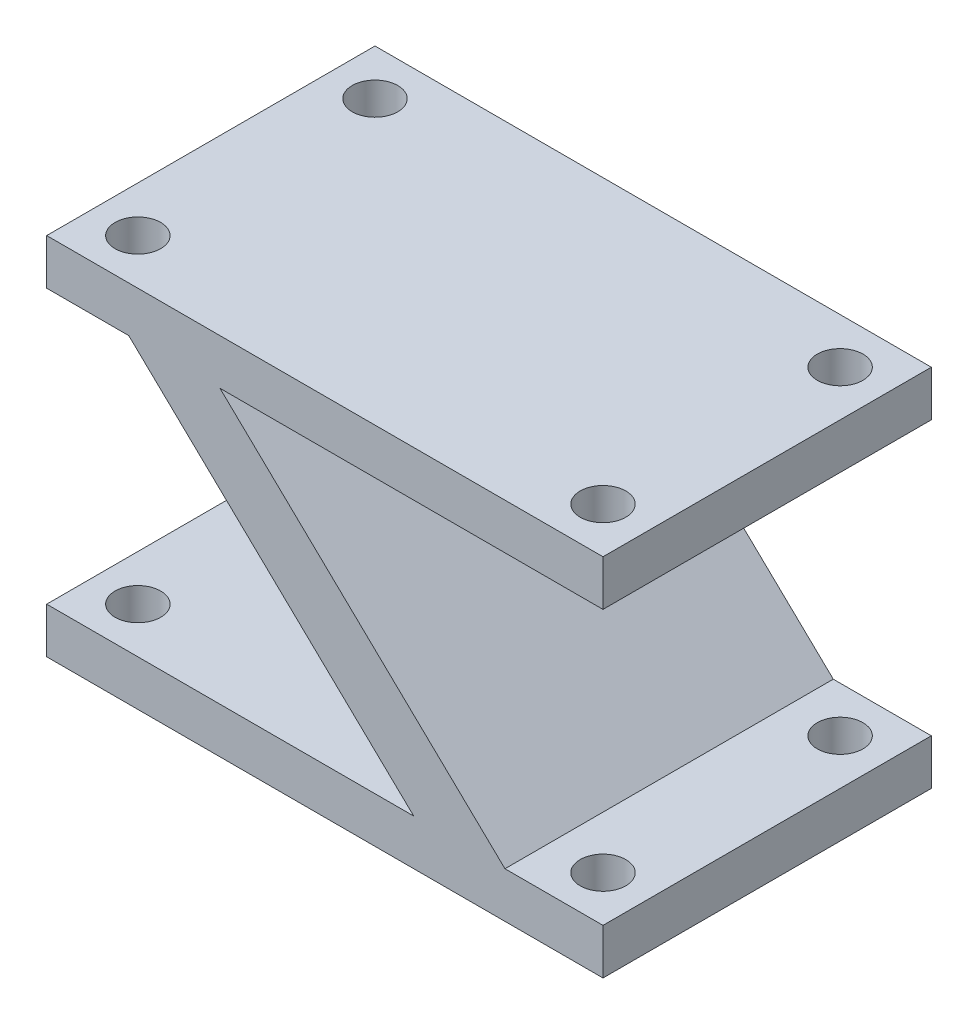
ISO-10303-21;
HEADER;
FILE_DESCRIPTION(('STEP AP214'),'2;1');
FILE_NAME('part.step','',(''),(''),'','','');
FILE_SCHEMA(('AUTOMOTIVE_DESIGN { 1 0 10303 214 1 1 1 1 }'));
ENDSEC;
DATA;
#1=APPLICATION_CONTEXT('core data for automotive mechanical design processes');
#2=APPLICATION_PROTOCOL_DEFINITION('international standard','automotive_design',2000,#1);
#3=PRODUCT_CONTEXT('',#1,'mechanical');
#4=PRODUCT('Part','Part','',(#3));
#5=PRODUCT_RELATED_PRODUCT_CATEGORY('part','',(#4));
#6=PRODUCT_DEFINITION_FORMATION('','',#4);
#7=PRODUCT_DEFINITION_CONTEXT('part definition',#1,'design');
#8=PRODUCT_DEFINITION('design','',#6,#7);
#9=PRODUCT_DEFINITION_SHAPE('','',#8);
#10=(LENGTH_UNIT() NAMED_UNIT(*) SI_UNIT(.MILLI.,.METRE.));
#11=(NAMED_UNIT(*) PLANE_ANGLE_UNIT() SI_UNIT($,.RADIAN.));
#12=(NAMED_UNIT(*) SI_UNIT($,.STERADIAN.) SOLID_ANGLE_UNIT());
#13=UNCERTAINTY_MEASURE_WITH_UNIT(LENGTH_MEASURE(1.E-05),#10,'distance_accuracy_value','');
#14=(GEOMETRIC_REPRESENTATION_CONTEXT(3) GLOBAL_UNCERTAINTY_ASSIGNED_CONTEXT((#13)) GLOBAL_UNIT_ASSIGNED_CONTEXT((#10,
#11,#12)) REPRESENTATION_CONTEXT('',''));
#15=CARTESIAN_POINT('',(0.,0.,0.));
#16=DIRECTION('',(0.,0.,1.));
#17=DIRECTION('',(1.,0.,0.));
#18=AXIS2_PLACEMENT_3D('',#15,#16,#17);
#19=CARTESIAN_POINT('',(0.,5.,0.));
#20=DIRECTION('',(0.,-1.,0.));
#21=DIRECTION('',(0.,0.,-1.));
#22=AXIS2_PLACEMENT_3D('',#19,#20,#21);
#23=PLANE('',#22);
#24=CARTESIAN_POINT('',(-25.5,5.,13.));
#25=DIRECTION('',(0.,1.,0.));
#26=DIRECTION('',(0.,0.,1.));
#27=AXIS2_PLACEMENT_3D('',#24,#25,#26);
#28=CIRCLE('',#27,2.5);
#29=CARTESIAN_POINT('',(-25.5,5.,15.5));
#30=VERTEX_POINT('',#29);
#31=EDGE_CURVE('E193',#30,#30,#28,.T.);
#32=ORIENTED_EDGE('',*,*,#31,.F.);
#33=EDGE_LOOP('',(#32));
#34=FACE_BOUND('',#33,.T.);
#35=CARTESIAN_POINT('',(-25.5,5.,-13.));
#36=DIRECTION('',(0.,1.,0.));
#37=DIRECTION('',(0.,0.,1.));
#38=AXIS2_PLACEMENT_3D('',#35,#36,#37);
#39=CIRCLE('',#38,2.5);
#40=CARTESIAN_POINT('',(-25.5,5.,-10.5));
#41=VERTEX_POINT('',#40);
#42=EDGE_CURVE('E217',#41,#41,#39,.T.);
#43=ORIENTED_EDGE('',*,*,#42,.F.);
#44=EDGE_LOOP('',(#43));
#45=FACE_BOUND('',#44,.T.);
#46=DIRECTION('',(0.,0.,1.));
#47=VECTOR('',#46,1.);
#48=CARTESIAN_POINT('',(9.75,5.,-69.0055144077579));
#49=LINE('',#48,#47);
#50=CARTESIAN_POINT('',(9.74999999999999,5.,-18.));
#51=VERTEX_POINT('',#50);
#52=CARTESIAN_POINT('',(9.75,5.,18.));
#53=VERTEX_POINT('',#52);
#54=EDGE_CURVE('E63',#51,#53,#49,.T.);
#55=ORIENTED_EDGE('',*,*,#54,.F.);
#56=DIRECTION('',(-1.,0.,0.));
#57=VECTOR('',#56,1.);
#58=CARTESIAN_POINT('',(-30.5,5.,-18.));
#59=LINE('',#58,#57);
#60=CARTESIAN_POINT('',(-30.5,5.,-18.));
#61=VERTEX_POINT('',#60);
#62=EDGE_CURVE('E229',#51,#61,#59,.T.);
#63=ORIENTED_EDGE('',*,*,#62,.T.);
#64=DIRECTION('',(0.,0.,1.));
#65=VECTOR('',#64,1.);
#66=CARTESIAN_POINT('',(-30.5,5.,18.));
#67=LINE('',#66,#65);
#68=CARTESIAN_POINT('',(-30.5,5.,18.));
#69=VERTEX_POINT('',#68);
#70=EDGE_CURVE('E234',#61,#69,#67,.T.);
#71=ORIENTED_EDGE('',*,*,#70,.T.);
#72=DIRECTION('',(1.,0.,0.));
#73=VECTOR('',#72,1.);
#74=CARTESIAN_POINT('',(-30.5,5.,18.));
#75=LINE('',#74,#73);
#76=EDGE_CURVE('E238',#69,#53,#75,.T.);
#77=ORIENTED_EDGE('',*,*,#76,.T.);
#78=EDGE_LOOP('',(#55,#63,#71,#77));
#79=FACE_BOUND('',#78,.T.);
#80=ADVANCED_FACE('F39',(#34,#45,#79),#23,.F.);
#81=CARTESIAN_POINT('',(30.5,5.,-18.));
#82=VERTEX_POINT('',#81);
#83=CARTESIAN_POINT('',(19.75,5.,-18.));
#84=VERTEX_POINT('',#83);
#85=EDGE_CURVE('E231',#82,#84,#59,.T.);
#86=ORIENTED_EDGE('',*,*,#85,.T.);
#87=DIRECTION('',(0.,0.,1.));
#88=VECTOR('',#87,1.);
#89=CARTESIAN_POINT('',(19.75,5.,-69.0055144077579));
#90=LINE('',#89,#88);
#91=CARTESIAN_POINT('',(19.75,5.,18.));
#92=VERTEX_POINT('',#91);
#93=EDGE_CURVE('E55',#84,#92,#90,.T.);
#94=ORIENTED_EDGE('',*,*,#93,.T.);
#95=CARTESIAN_POINT('',(30.5,5.,18.));
#96=VERTEX_POINT('',#95);
#97=EDGE_CURVE('E237',#92,#96,#75,.T.);
#98=ORIENTED_EDGE('',*,*,#97,.T.);
#99=DIRECTION('',(0.,0.,-1.));
#100=VECTOR('',#99,1.);
#101=CARTESIAN_POINT('',(30.5,5.,18.));
#102=LINE('',#101,#100);
#103=EDGE_CURVE('E225',#96,#82,#102,.T.);
#104=ORIENTED_EDGE('',*,*,#103,.T.);
#105=EDGE_LOOP('',(#86,#94,#98,#104));
#106=FACE_BOUND('',#105,.T.);
#107=CARTESIAN_POINT('',(25.5,5.,-13.));
#108=DIRECTION('',(0.,1.,0.));
#109=DIRECTION('',(0.,0.,1.));
#110=AXIS2_PLACEMENT_3D('',#107,#108,#109);
#111=CIRCLE('',#110,2.5);
#112=CARTESIAN_POINT('',(25.5,5.,-10.5));
#113=VERTEX_POINT('',#112);
#114=EDGE_CURVE('E209',#113,#113,#111,.T.);
#115=ORIENTED_EDGE('',*,*,#114,.F.);
#116=EDGE_LOOP('',(#115));
#117=FACE_BOUND('',#116,.T.);
#118=CARTESIAN_POINT('',(25.5,5.,13.));
#119=DIRECTION('',(0.,1.,0.));
#120=DIRECTION('',(0.,0.,1.));
#121=AXIS2_PLACEMENT_3D('',#118,#119,#120);
#122=CIRCLE('',#121,2.5);
#123=CARTESIAN_POINT('',(25.5,5.,15.5));
#124=VERTEX_POINT('',#123);
#125=EDGE_CURVE('E201',#124,#124,#122,.T.);
#126=ORIENTED_EDGE('',*,*,#125,.F.);
#127=EDGE_LOOP('',(#126));
#128=FACE_BOUND('',#127,.T.);
#129=ADVANCED_FACE('F278',(#106,#117,#128),#23,.F.);
#130=CARTESIAN_POINT('',(0.,0.,0.));
#131=DIRECTION('',(0.,-1.,0.));
#132=DIRECTION('',(0.,0.,-1.));
#133=AXIS2_PLACEMENT_3D('',#130,#131,#132);
#134=PLANE('',#133);
#135=CARTESIAN_POINT('',(25.5,0.,13.));
#136=DIRECTION('',(0.,1.,0.));
#137=DIRECTION('',(0.,0.,1.));
#138=AXIS2_PLACEMENT_3D('',#135,#136,#137);
#139=CIRCLE('',#138,2.5);
#140=CARTESIAN_POINT('',(25.5,0.,15.5));
#141=VERTEX_POINT('',#140);
#142=EDGE_CURVE('E197',#141,#141,#139,.T.);
#143=ORIENTED_EDGE('',*,*,#142,.T.);
#144=EDGE_LOOP('',(#143));
#145=FACE_BOUND('',#144,.T.);
#146=CARTESIAN_POINT('',(-25.5,0.,-13.));
#147=DIRECTION('',(0.,1.,0.));
#148=DIRECTION('',(0.,0.,1.));
#149=AXIS2_PLACEMENT_3D('',#146,#147,#148);
#150=CIRCLE('',#149,2.5);
#151=CARTESIAN_POINT('',(-25.5,0.,-10.5));
#152=VERTEX_POINT('',#151);
#153=EDGE_CURVE('E213',#152,#152,#150,.T.);
#154=ORIENTED_EDGE('',*,*,#153,.T.);
#155=EDGE_LOOP('',(#154));
#156=FACE_BOUND('',#155,.T.);
#157=DIRECTION('',(0.,0.,-1.));
#158=VECTOR('',#157,1.);
#159=CARTESIAN_POINT('',(30.5,0.,18.));
#160=LINE('',#159,#158);
#161=CARTESIAN_POINT('',(30.5,0.,18.));
#162=VERTEX_POINT('',#161);
#163=CARTESIAN_POINT('',(30.5,0.,-18.));
#164=VERTEX_POINT('',#163);
#165=EDGE_CURVE('E221',#162,#164,#160,.T.);
#166=ORIENTED_EDGE('',*,*,#165,.F.);
#167=DIRECTION('',(1.,0.,0.));
#168=VECTOR('',#167,1.);
#169=CARTESIAN_POINT('',(-30.5,0.,18.));
#170=LINE('',#169,#168);
#171=CARTESIAN_POINT('',(-30.5,0.,18.));
#172=VERTEX_POINT('',#171);
#173=EDGE_CURVE('E230',#172,#162,#170,.T.);
#174=ORIENTED_EDGE('',*,*,#173,.F.);
#175=DIRECTION('',(0.,0.,1.));
#176=VECTOR('',#175,1.);
#177=CARTESIAN_POINT('',(-30.5,0.,18.));
#178=LINE('',#177,#176);
#179=CARTESIAN_POINT('',(-30.5,0.,-18.));
#180=VERTEX_POINT('',#179);
#181=EDGE_CURVE('E248',#180,#172,#178,.T.);
#182=ORIENTED_EDGE('',*,*,#181,.F.);
#183=DIRECTION('',(-1.,0.,0.));
#184=VECTOR('',#183,1.);
#185=CARTESIAN_POINT('',(-30.5,0.,-18.));
#186=LINE('',#185,#184);
#187=EDGE_CURVE('E245',#164,#180,#186,.T.);
#188=ORIENTED_EDGE('',*,*,#187,.F.);
#189=EDGE_LOOP('',(#166,#174,#182,#188));
#190=FACE_BOUND('',#189,.T.);
#191=CARTESIAN_POINT('',(25.5,0.,-13.));
#192=DIRECTION('',(0.,1.,0.));
#193=DIRECTION('',(0.,0.,1.));
#194=AXIS2_PLACEMENT_3D('',#191,#192,#193);
#195=CIRCLE('',#194,2.5);
#196=CARTESIAN_POINT('',(25.5,0.,-10.5));
#197=VERTEX_POINT('',#196);
#198=EDGE_CURVE('E205',#197,#197,#195,.T.);
#199=ORIENTED_EDGE('',*,*,#198,.T.);
#200=EDGE_LOOP('',(#199));
#201=FACE_BOUND('',#200,.T.);
#202=CARTESIAN_POINT('',(-25.5,0.,13.));
#203=DIRECTION('',(0.,1.,0.));
#204=DIRECTION('',(0.,0.,1.));
#205=AXIS2_PLACEMENT_3D('',#202,#203,#204);
#206=CIRCLE('',#205,2.5);
#207=CARTESIAN_POINT('',(-25.5,0.,15.5));
#208=VERTEX_POINT('',#207);
#209=EDGE_CURVE('E192',#208,#208,#206,.T.);
#210=ORIENTED_EDGE('',*,*,#209,.T.);
#211=EDGE_LOOP('',(#210));
#212=FACE_BOUND('',#211,.T.);
#213=ADVANCED_FACE('F271',(#145,#156,#190,#201,#212),#134,.T.);
#214=CARTESIAN_POINT('',(30.5,5.,18.));
#215=DIRECTION('',(-1.,0.,0.));
#216=DIRECTION('',(0.,0.,1.));
#217=AXIS2_PLACEMENT_3D('',#214,#215,#216);
#218=PLANE('',#217);
#219=ORIENTED_EDGE('',*,*,#165,.T.);
#220=DIRECTION('',(0.,-1.,0.));
#221=VECTOR('',#220,1.);
#222=CARTESIAN_POINT('',(30.5,5.,-18.));
#223=LINE('',#222,#221);
#224=EDGE_CURVE('E11',#82,#164,#223,.T.);
#225=ORIENTED_EDGE('',*,*,#224,.F.);
#226=ORIENTED_EDGE('',*,*,#103,.F.);
#227=DIRECTION('',(0.,-1.,0.));
#228=VECTOR('',#227,1.);
#229=CARTESIAN_POINT('',(30.5,5.,18.));
#230=LINE('',#229,#228);
#231=EDGE_CURVE('E241',#96,#162,#230,.T.);
#232=ORIENTED_EDGE('',*,*,#231,.T.);
#233=EDGE_LOOP('',(#219,#225,#226,#232));
#234=FACE_BOUND('',#233,.T.);
#235=ADVANCED_FACE('F41',(#234),#218,.F.);
#236=CARTESIAN_POINT('',(-30.5,5.,-18.));
#237=DIRECTION('',(0.,0.,1.));
#238=DIRECTION('',(1.,0.,0.));
#239=AXIS2_PLACEMENT_3D('',#236,#237,#238);
#240=PLANE('',#239);
#241=ORIENTED_EDGE('',*,*,#187,.T.);
#242=DIRECTION('',(0.,-1.,0.));
#243=VECTOR('',#242,1.);
#244=CARTESIAN_POINT('',(-30.5,5.,-18.));
#245=LINE('',#244,#243);
#246=EDGE_CURVE('E48',#61,#180,#245,.T.);
#247=ORIENTED_EDGE('',*,*,#246,.F.);
#248=ORIENTED_EDGE('',*,*,#62,.F.);
#249=DIRECTION('',(-0.721387321030952,0.692531828189714,0.));
#250=VECTOR('',#249,1.);
#251=CARTESIAN_POINT('',(-21.5,35.,-18.));
#252=LINE('',#251,#250);
#253=CARTESIAN_POINT('',(-21.5,35.,-18.));
#254=VERTEX_POINT('',#253);
#255=EDGE_CURVE('E170',#51,#254,#252,.T.);
#256=ORIENTED_EDGE('',*,*,#255,.T.);
#257=DIRECTION('',(-1.,0.,0.));
#258=VECTOR('',#257,1.);
#259=CARTESIAN_POINT('',(-30.5,35.,-18.));
#260=LINE('',#259,#258);
#261=CARTESIAN_POINT('',(-30.5,35.,-18.));
#262=VERTEX_POINT('',#261);
#263=EDGE_CURVE('E293',#254,#262,#260,.T.);
#264=ORIENTED_EDGE('',*,*,#263,.T.);
#265=DIRECTION('',(0.,-1.,0.));
#266=VECTOR('',#265,1.);
#267=CARTESIAN_POINT('',(-30.5,40.,-18.));
#268=LINE('',#267,#266);
#269=CARTESIAN_POINT('',(-30.5,40.,-18.));
#270=VERTEX_POINT('',#269);
#271=EDGE_CURVE('E307',#270,#262,#268,.T.);
#272=ORIENTED_EDGE('',*,*,#271,.F.);
#273=DIRECTION('',(-1.,0.,0.));
#274=VECTOR('',#273,1.);
#275=CARTESIAN_POINT('',(-30.5,40.,-18.));
#276=LINE('',#275,#274);
#277=CARTESIAN_POINT('',(30.5,40.,-18.));
#278=VERTEX_POINT('',#277);
#279=EDGE_CURVE('E148',#278,#270,#276,.T.);
#280=ORIENTED_EDGE('',*,*,#279,.F.);
#281=DIRECTION('',(0.,-1.,0.));
#282=VECTOR('',#281,1.);
#283=CARTESIAN_POINT('',(30.5,40.,-18.));
#284=LINE('',#283,#282);
#285=CARTESIAN_POINT('',(30.5,35.,-18.));
#286=VERTEX_POINT('',#285);
#287=EDGE_CURVE('E166',#278,#286,#284,.T.);
#288=ORIENTED_EDGE('',*,*,#287,.T.);
#289=CARTESIAN_POINT('',(-11.5,35.,-18.));
#290=VERTEX_POINT('',#289);
#291=EDGE_CURVE('E153',#286,#290,#260,.T.);
#292=ORIENTED_EDGE('',*,*,#291,.T.);
#293=DIRECTION('',(0.721387321030952,-0.692531828189714,0.));
#294=VECTOR('',#293,1.);
#295=CARTESIAN_POINT('',(19.75,5.,-18.));
#296=LINE('',#295,#294);
#297=EDGE_CURVE('E173',#290,#84,#296,.T.);
#298=ORIENTED_EDGE('',*,*,#297,.T.);
#299=ORIENTED_EDGE('',*,*,#85,.F.);
#300=ORIENTED_EDGE('',*,*,#224,.T.);
#301=EDGE_LOOP('',(#241,#247,#248,#256,#264,#272,#280,#288,#292,#298,#299,#300));
#302=FACE_BOUND('',#301,.T.);
#303=ADVANCED_FACE('F284',(#302),#240,.F.);
#304=CARTESIAN_POINT('',(-30.5,5.,18.));
#305=DIRECTION('',(1.,0.,0.));
#306=DIRECTION('',(0.,0.,-1.));
#307=AXIS2_PLACEMENT_3D('',#304,#305,#306);
#308=PLANE('',#307);
#309=ORIENTED_EDGE('',*,*,#181,.T.);
#310=DIRECTION('',(0.,-1.,0.));
#311=VECTOR('',#310,1.);
#312=CARTESIAN_POINT('',(-30.5,5.,18.));
#313=LINE('',#312,#311);
#314=EDGE_CURVE('E256',#69,#172,#313,.T.);
#315=ORIENTED_EDGE('',*,*,#314,.F.);
#316=ORIENTED_EDGE('',*,*,#70,.F.);
#317=ORIENTED_EDGE('',*,*,#246,.T.);
#318=EDGE_LOOP('',(#309,#315,#316,#317));
#319=FACE_BOUND('',#318,.T.);
#320=ADVANCED_FACE('F265',(#319),#308,.F.);
#321=CARTESIAN_POINT('',(-30.5,5.,18.));
#322=DIRECTION('',(0.,0.,-1.));
#323=DIRECTION('',(-1.,0.,0.));
#324=AXIS2_PLACEMENT_3D('',#321,#322,#323);
#325=PLANE('',#324);
#326=ORIENTED_EDGE('',*,*,#173,.T.);
#327=ORIENTED_EDGE('',*,*,#231,.F.);
#328=ORIENTED_EDGE('',*,*,#97,.F.);
#329=DIRECTION('',(-0.721387321030952,0.692531828189713,0.));
#330=VECTOR('',#329,1.);
#331=CARTESIAN_POINT('',(19.75,5.,18.));
#332=LINE('',#331,#330);
#333=CARTESIAN_POINT('',(-11.5,35.,18.));
#334=VERTEX_POINT('',#333);
#335=EDGE_CURVE('E159',#92,#334,#332,.T.);
#336=ORIENTED_EDGE('',*,*,#335,.T.);
#337=DIRECTION('',(1.,0.,0.));
#338=VECTOR('',#337,1.);
#339=CARTESIAN_POINT('',(-30.5,35.,18.));
#340=LINE('',#339,#338);
#341=CARTESIAN_POINT('',(30.5,35.,18.));
#342=VERTEX_POINT('',#341);
#343=EDGE_CURVE('E296',#334,#342,#340,.T.);
#344=ORIENTED_EDGE('',*,*,#343,.T.);
#345=DIRECTION('',(0.,-1.,0.));
#346=VECTOR('',#345,1.);
#347=CARTESIAN_POINT('',(30.5,40.,18.));
#348=LINE('',#347,#346);
#349=CARTESIAN_POINT('',(30.5,40.,18.));
#350=VERTEX_POINT('',#349);
#351=EDGE_CURVE('E137',#350,#342,#348,.T.);
#352=ORIENTED_EDGE('',*,*,#351,.F.);
#353=DIRECTION('',(1.,0.,0.));
#354=VECTOR('',#353,1.);
#355=CARTESIAN_POINT('',(-30.5,40.,18.));
#356=LINE('',#355,#354);
#357=CARTESIAN_POINT('',(-30.5,40.,18.));
#358=VERTEX_POINT('',#357);
#359=EDGE_CURVE('E129',#358,#350,#356,.T.);
#360=ORIENTED_EDGE('',*,*,#359,.F.);
#361=DIRECTION('',(0.,-1.,0.));
#362=VECTOR('',#361,1.);
#363=CARTESIAN_POINT('',(-30.5,40.,18.));
#364=LINE('',#363,#362);
#365=CARTESIAN_POINT('',(-30.5,35.,18.));
#366=VERTEX_POINT('',#365);
#367=EDGE_CURVE('E134',#358,#366,#364,.T.);
#368=ORIENTED_EDGE('',*,*,#367,.T.);
#369=CARTESIAN_POINT('',(-21.5,35.,18.));
#370=VERTEX_POINT('',#369);
#371=EDGE_CURVE('E292',#366,#370,#340,.T.);
#372=ORIENTED_EDGE('',*,*,#371,.T.);
#373=DIRECTION('',(0.721387321030951,-0.692531828189713,0.));
#374=VECTOR('',#373,1.);
#375=CARTESIAN_POINT('',(-21.5,35.,18.));
#376=LINE('',#375,#374);
#377=EDGE_CURVE('E164',#370,#53,#376,.T.);
#378=ORIENTED_EDGE('',*,*,#377,.T.);
#379=ORIENTED_EDGE('',*,*,#76,.F.);
#380=ORIENTED_EDGE('',*,*,#314,.T.);
#381=EDGE_LOOP('',(#326,#327,#328,#336,#344,#352,#360,#368,#372,#378,#379,#380));
#382=FACE_BOUND('',#381,.T.);
#383=ADVANCED_FACE('F131',(#382),#325,.F.);
#384=CARTESIAN_POINT('',(-25.5,5.,-13.));
#385=DIRECTION('',(0.,-1.,0.));
#386=DIRECTION('',(0.,0.,-1.));
#387=AXIS2_PLACEMENT_3D('',#384,#385,#386);
#388=CYLINDRICAL_SURFACE('',#387,2.5);
#389=ORIENTED_EDGE('',*,*,#42,.T.);
#390=EDGE_LOOP('',(#389));
#391=FACE_BOUND('',#390,.T.);
#392=ORIENTED_EDGE('',*,*,#153,.F.);
#393=EDGE_LOOP('',(#392));
#394=FACE_BOUND('',#393,.T.);
#395=ADVANCED_FACE('F381',(#391,#394),#388,.F.);
#396=CARTESIAN_POINT('',(25.5,5.,-13.));
#397=DIRECTION('',(0.,-1.,0.));
#398=DIRECTION('',(0.,0.,-1.));
#399=AXIS2_PLACEMENT_3D('',#396,#397,#398);
#400=CYLINDRICAL_SURFACE('',#399,2.5);
#401=ORIENTED_EDGE('',*,*,#114,.T.);
#402=EDGE_LOOP('',(#401));
#403=FACE_BOUND('',#402,.T.);
#404=ORIENTED_EDGE('',*,*,#198,.F.);
#405=EDGE_LOOP('',(#404));
#406=FACE_BOUND('',#405,.T.);
#407=ADVANCED_FACE('F528',(#403,#406),#400,.F.);
#408=CARTESIAN_POINT('',(25.5,5.,13.));
#409=DIRECTION('',(0.,-1.,0.));
#410=DIRECTION('',(0.,0.,-1.));
#411=AXIS2_PLACEMENT_3D('',#408,#409,#410);
#412=CYLINDRICAL_SURFACE('',#411,2.5);
#413=ORIENTED_EDGE('',*,*,#125,.T.);
#414=EDGE_LOOP('',(#413));
#415=FACE_BOUND('',#414,.T.);
#416=ORIENTED_EDGE('',*,*,#142,.F.);
#417=EDGE_LOOP('',(#416));
#418=FACE_BOUND('',#417,.T.);
#419=ADVANCED_FACE('F525',(#415,#418),#412,.F.);
#420=CARTESIAN_POINT('',(-25.5,5.,13.));
#421=DIRECTION('',(0.,-1.,0.));
#422=DIRECTION('',(0.,0.,-1.));
#423=AXIS2_PLACEMENT_3D('',#420,#421,#422);
#424=CYLINDRICAL_SURFACE('',#423,2.5);
#425=ORIENTED_EDGE('',*,*,#31,.T.);
#426=EDGE_LOOP('',(#425));
#427=FACE_BOUND('',#426,.T.);
#428=ORIENTED_EDGE('',*,*,#209,.F.);
#429=EDGE_LOOP('',(#428));
#430=FACE_BOUND('',#429,.T.);
#431=ADVANCED_FACE('F431',(#427,#430),#424,.F.);
#432=CARTESIAN_POINT('',(-21.5,35.,-69.0055144077579));
#433=DIRECTION('',(-0.692531828189713,-0.721387321030951,0.));
#434=DIRECTION('',(0.721387321030952,-0.692531828189714,0.));
#435=AXIS2_PLACEMENT_3D('',#432,#433,#434);
#436=PLANE('',#435);
#437=ORIENTED_EDGE('',*,*,#255,.F.);
#438=ORIENTED_EDGE('',*,*,#54,.T.);
#439=ORIENTED_EDGE('',*,*,#377,.F.);
#440=DIRECTION('',(0.,0.,1.));
#441=VECTOR('',#440,1.);
#442=CARTESIAN_POINT('',(-21.5,35.,-69.0055144077579));
#443=LINE('',#442,#441);
#444=EDGE_CURVE('E180',#254,#370,#443,.T.);
#445=ORIENTED_EDGE('',*,*,#444,.F.);
#446=EDGE_LOOP('',(#437,#438,#439,#445));
#447=FACE_BOUND('',#446,.T.);
#448=ADVANCED_FACE('F287',(#447),#436,.T.);
#449=CARTESIAN_POINT('',(19.75,5.,-69.0055144077579));
#450=DIRECTION('',(0.692531828189713,0.721387321030951,0.));
#451=DIRECTION('',(-0.721387321030952,0.692531828189714,0.));
#452=AXIS2_PLACEMENT_3D('',#449,#450,#451);
#453=PLANE('',#452);
#454=ORIENTED_EDGE('',*,*,#297,.F.);
#455=DIRECTION('',(0.,0.,1.));
#456=VECTOR('',#455,1.);
#457=CARTESIAN_POINT('',(-11.5,35.,-69.0055144077579));
#458=LINE('',#457,#456);
#459=EDGE_CURVE('E183',#290,#334,#458,.T.);
#460=ORIENTED_EDGE('',*,*,#459,.T.);
#461=ORIENTED_EDGE('',*,*,#335,.F.);
#462=ORIENTED_EDGE('',*,*,#93,.F.);
#463=EDGE_LOOP('',(#454,#460,#461,#462));
#464=FACE_BOUND('',#463,.T.);
#465=ADVANCED_FACE('F319',(#464),#453,.T.);
#466=CARTESIAN_POINT('',(0.,35.,0.));
#467=DIRECTION('',(0.,-1.,0.));
#468=DIRECTION('',(1.,0.,0.));
#469=AXIS2_PLACEMENT_3D('',#466,#467,#468);
#470=PLANE('',#469);
#471=CARTESIAN_POINT('',(25.5,35.,13.));
#472=DIRECTION('',(0.,1.,0.));
#473=DIRECTION('',(-1.,0.,0.));
#474=AXIS2_PLACEMENT_3D('',#471,#472,#473);
#475=CIRCLE('',#474,2.5);
#476=CARTESIAN_POINT('',(23.,35.,13.));
#477=VERTEX_POINT('',#476);
#478=EDGE_CURVE('E350',#477,#477,#475,.T.);
#479=ORIENTED_EDGE('',*,*,#478,.T.);
#480=EDGE_LOOP('',(#479));
#481=FACE_BOUND('',#480,.T.);
#482=CARTESIAN_POINT('',(25.5,35.,-13.));
#483=DIRECTION('',(0.,1.,0.));
#484=DIRECTION('',(-1.,0.,0.));
#485=AXIS2_PLACEMENT_3D('',#482,#483,#484);
#486=CIRCLE('',#485,2.5);
#487=CARTESIAN_POINT('',(23.,35.,-13.));
#488=VERTEX_POINT('',#487);
#489=EDGE_CURVE('E342',#488,#488,#486,.T.);
#490=ORIENTED_EDGE('',*,*,#489,.T.);
#491=EDGE_LOOP('',(#490));
#492=FACE_BOUND('',#491,.T.);
#493=ORIENTED_EDGE('',*,*,#459,.F.);
#494=ORIENTED_EDGE('',*,*,#291,.F.);
#495=DIRECTION('',(0.,0.,-1.));
#496=VECTOR('',#495,1.);
#497=CARTESIAN_POINT('',(30.5,35.,18.));
#498=LINE('',#497,#496);
#499=EDGE_CURVE('E295',#342,#286,#498,.T.);
#500=ORIENTED_EDGE('',*,*,#499,.F.);
#501=ORIENTED_EDGE('',*,*,#343,.F.);
#502=EDGE_LOOP('',(#493,#494,#500,#501));
#503=FACE_BOUND('',#502,.T.);
#504=ADVANCED_FACE('F317',(#481,#492,#503),#470,.T.);
#505=CARTESIAN_POINT('',(0.,40.,0.));
#506=DIRECTION('',(0.,-1.,0.));
#507=DIRECTION('',(1.,0.,0.));
#508=AXIS2_PLACEMENT_3D('',#505,#506,#507);
#509=PLANE('',#508);
#510=DIRECTION('',(0.,0.,1.));
#511=VECTOR('',#510,1.);
#512=CARTESIAN_POINT('',(-30.5,40.,18.));
#513=LINE('',#512,#511);
#514=EDGE_CURVE('E142',#270,#358,#513,.T.);
#515=ORIENTED_EDGE('',*,*,#514,.T.);
#516=ORIENTED_EDGE('',*,*,#359,.T.);
#517=DIRECTION('',(0.,0.,-1.));
#518=VECTOR('',#517,1.);
#519=CARTESIAN_POINT('',(30.5,40.,18.));
#520=LINE('',#519,#518);
#521=EDGE_CURVE('E141',#350,#278,#520,.T.);
#522=ORIENTED_EDGE('',*,*,#521,.T.);
#523=ORIENTED_EDGE('',*,*,#279,.T.);
#524=EDGE_LOOP('',(#515,#516,#522,#523));
#525=FACE_BOUND('',#524,.T.);
#526=CARTESIAN_POINT('',(-25.5,40.,13.));
#527=DIRECTION('',(0.,1.,0.));
#528=DIRECTION('',(-1.,0.,0.));
#529=AXIS2_PLACEMENT_3D('',#526,#527,#528);
#530=CIRCLE('',#529,2.5);
#531=CARTESIAN_POINT('',(-28.,40.,13.));
#532=VERTEX_POINT('',#531);
#533=EDGE_CURVE('E329',#532,#532,#530,.T.);
#534=ORIENTED_EDGE('',*,*,#533,.F.);
#535=EDGE_LOOP('',(#534));
#536=FACE_BOUND('',#535,.T.);
#537=CARTESIAN_POINT('',(-25.5,40.,-13.));
#538=DIRECTION('',(0.,1.,0.));
#539=DIRECTION('',(-1.,0.,0.));
#540=AXIS2_PLACEMENT_3D('',#537,#538,#539);
#541=CIRCLE('',#540,2.5);
#542=CARTESIAN_POINT('',(-28.,40.,-13.));
#543=VERTEX_POINT('',#542);
#544=EDGE_CURVE('E330',#543,#543,#541,.T.);
#545=ORIENTED_EDGE('',*,*,#544,.F.);
#546=EDGE_LOOP('',(#545));
#547=FACE_BOUND('',#546,.T.);
#548=CARTESIAN_POINT('',(25.5,40.,-13.));
#549=DIRECTION('',(0.,1.,0.));
#550=DIRECTION('',(-1.,0.,0.));
#551=AXIS2_PLACEMENT_3D('',#548,#549,#550);
#552=CIRCLE('',#551,2.5);
#553=CARTESIAN_POINT('',(23.,40.,-13.));
#554=VERTEX_POINT('',#553);
#555=EDGE_CURVE('E338',#554,#554,#552,.T.);
#556=ORIENTED_EDGE('',*,*,#555,.F.);
#557=EDGE_LOOP('',(#556));
#558=FACE_BOUND('',#557,.T.);
#559=CARTESIAN_POINT('',(25.5,40.,13.));
#560=DIRECTION('',(0.,1.,0.));
#561=DIRECTION('',(-1.,0.,0.));
#562=AXIS2_PLACEMENT_3D('',#559,#560,#561);
#563=CIRCLE('',#562,2.5);
#564=CARTESIAN_POINT('',(23.,40.,13.));
#565=VERTEX_POINT('',#564);
#566=EDGE_CURVE('E346',#565,#565,#563,.T.);
#567=ORIENTED_EDGE('',*,*,#566,.F.);
#568=EDGE_LOOP('',(#567));
#569=FACE_BOUND('',#568,.T.);
#570=ADVANCED_FACE('F145',(#525,#536,#547,#558,#569),#509,.F.);
#571=CARTESIAN_POINT('',(-25.5,35.,13.));
#572=DIRECTION('',(0.,1.,0.));
#573=DIRECTION('',(-1.,0.,0.));
#574=AXIS2_PLACEMENT_3D('',#571,#572,#573);
#575=CIRCLE('',#574,2.5);
#576=CARTESIAN_POINT('',(-28.,35.,13.));
#577=VERTEX_POINT('',#576);
#578=EDGE_CURVE('E325',#577,#577,#575,.T.);
#579=ORIENTED_EDGE('',*,*,#578,.T.);
#580=EDGE_LOOP('',(#579));
#581=FACE_BOUND('',#580,.T.);
#582=ORIENTED_EDGE('',*,*,#263,.F.);
#583=ORIENTED_EDGE('',*,*,#444,.T.);
#584=ORIENTED_EDGE('',*,*,#371,.F.);
#585=DIRECTION('',(0.,0.,1.));
#586=VECTOR('',#585,1.);
#587=CARTESIAN_POINT('',(-30.5,35.,18.));
#588=LINE('',#587,#586);
#589=EDGE_CURVE('E157',#262,#366,#588,.T.);
#590=ORIENTED_EDGE('',*,*,#589,.F.);
#591=EDGE_LOOP('',(#582,#583,#584,#590));
#592=FACE_BOUND('',#591,.T.);
#593=CARTESIAN_POINT('',(-25.5,35.,-13.));
#594=DIRECTION('',(0.,1.,0.));
#595=DIRECTION('',(-1.,0.,0.));
#596=AXIS2_PLACEMENT_3D('',#593,#594,#595);
#597=CIRCLE('',#596,2.5);
#598=CARTESIAN_POINT('',(-28.,35.,-13.));
#599=VERTEX_POINT('',#598);
#600=EDGE_CURVE('E334',#599,#599,#597,.T.);
#601=ORIENTED_EDGE('',*,*,#600,.T.);
#602=EDGE_LOOP('',(#601));
#603=FACE_BOUND('',#602,.T.);
#604=ADVANCED_FACE('F290',(#581,#592,#603),#470,.T.);
#605=CARTESIAN_POINT('',(-30.5,40.,18.));
#606=DIRECTION('',(1.,0.,0.));
#607=DIRECTION('',(0.,1.,0.));
#608=AXIS2_PLACEMENT_3D('',#605,#606,#607);
#609=PLANE('',#608);
#610=ORIENTED_EDGE('',*,*,#589,.T.);
#611=ORIENTED_EDGE('',*,*,#367,.F.);
#612=ORIENTED_EDGE('',*,*,#514,.F.);
#613=ORIENTED_EDGE('',*,*,#271,.T.);
#614=EDGE_LOOP('',(#610,#611,#612,#613));
#615=FACE_BOUND('',#614,.T.);
#616=ADVANCED_FACE('F155',(#615),#609,.F.);
#617=CARTESIAN_POINT('',(30.5,40.,18.));
#618=DIRECTION('',(-1.,0.,0.));
#619=DIRECTION('',(0.,-1.,0.));
#620=AXIS2_PLACEMENT_3D('',#617,#618,#619);
#621=PLANE('',#620);
#622=ORIENTED_EDGE('',*,*,#499,.T.);
#623=ORIENTED_EDGE('',*,*,#287,.F.);
#624=ORIENTED_EDGE('',*,*,#521,.F.);
#625=ORIENTED_EDGE('',*,*,#351,.T.);
#626=EDGE_LOOP('',(#622,#623,#624,#625));
#627=FACE_BOUND('',#626,.T.);
#628=ADVANCED_FACE('F320',(#627),#621,.F.);
#629=CARTESIAN_POINT('',(-25.5,40.,13.));
#630=DIRECTION('',(0.,-1.,0.));
#631=DIRECTION('',(1.,0.,0.));
#632=AXIS2_PLACEMENT_3D('',#629,#630,#631);
#633=CYLINDRICAL_SURFACE('',#632,2.5);
#634=ORIENTED_EDGE('',*,*,#533,.T.);
#635=EDGE_LOOP('',(#634));
#636=FACE_BOUND('',#635,.T.);
#637=ORIENTED_EDGE('',*,*,#578,.F.);
#638=EDGE_LOOP('',(#637));
#639=FACE_BOUND('',#638,.T.);
#640=ADVANCED_FACE('F471',(#636,#639),#633,.F.);
#641=CARTESIAN_POINT('',(-25.5,40.,-13.));
#642=DIRECTION('',(0.,-1.,0.));
#643=DIRECTION('',(1.,0.,0.));
#644=AXIS2_PLACEMENT_3D('',#641,#642,#643);
#645=CYLINDRICAL_SURFACE('',#644,2.5);
#646=ORIENTED_EDGE('',*,*,#544,.T.);
#647=EDGE_LOOP('',(#646));
#648=FACE_BOUND('',#647,.T.);
#649=ORIENTED_EDGE('',*,*,#600,.F.);
#650=EDGE_LOOP('',(#649));
#651=FACE_BOUND('',#650,.T.);
#652=ADVANCED_FACE('F480',(#648,#651),#645,.F.);
#653=CARTESIAN_POINT('',(25.5,40.,-13.));
#654=DIRECTION('',(0.,-1.,0.));
#655=DIRECTION('',(1.,0.,0.));
#656=AXIS2_PLACEMENT_3D('',#653,#654,#655);
#657=CYLINDRICAL_SURFACE('',#656,2.5);
#658=ORIENTED_EDGE('',*,*,#555,.T.);
#659=EDGE_LOOP('',(#658));
#660=FACE_BOUND('',#659,.T.);
#661=ORIENTED_EDGE('',*,*,#489,.F.);
#662=EDGE_LOOP('',(#661));
#663=FACE_BOUND('',#662,.T.);
#664=ADVANCED_FACE('F489',(#660,#663),#657,.F.);
#665=CARTESIAN_POINT('',(25.5,40.,13.));
#666=DIRECTION('',(0.,-1.,0.));
#667=DIRECTION('',(1.,0.,0.));
#668=AXIS2_PLACEMENT_3D('',#665,#666,#667);
#669=CYLINDRICAL_SURFACE('',#668,2.5);
#670=ORIENTED_EDGE('',*,*,#566,.T.);
#671=EDGE_LOOP('',(#670));
#672=FACE_BOUND('',#671,.T.);
#673=ORIENTED_EDGE('',*,*,#478,.F.);
#674=EDGE_LOOP('',(#673));
#675=FACE_BOUND('',#674,.T.);
#676=ADVANCED_FACE('F358',(#672,#675),#669,.F.);
#677=CLOSED_SHELL('',(#80,#129,#213,#235,#303,#320,#383,#395,#407,#419,#431,#448,#465,#504,#570,
#604,#616,#628,#640,#652,#664,#676));
#678=MANIFOLD_SOLID_BREP('B2',#677);
#679=ADVANCED_BREP_SHAPE_REPRESENTATION('',(#18,#678),#14);
#680=SHAPE_DEFINITION_REPRESENTATION(#9,#679);
ENDSEC;
END-ISO-10303-21;
